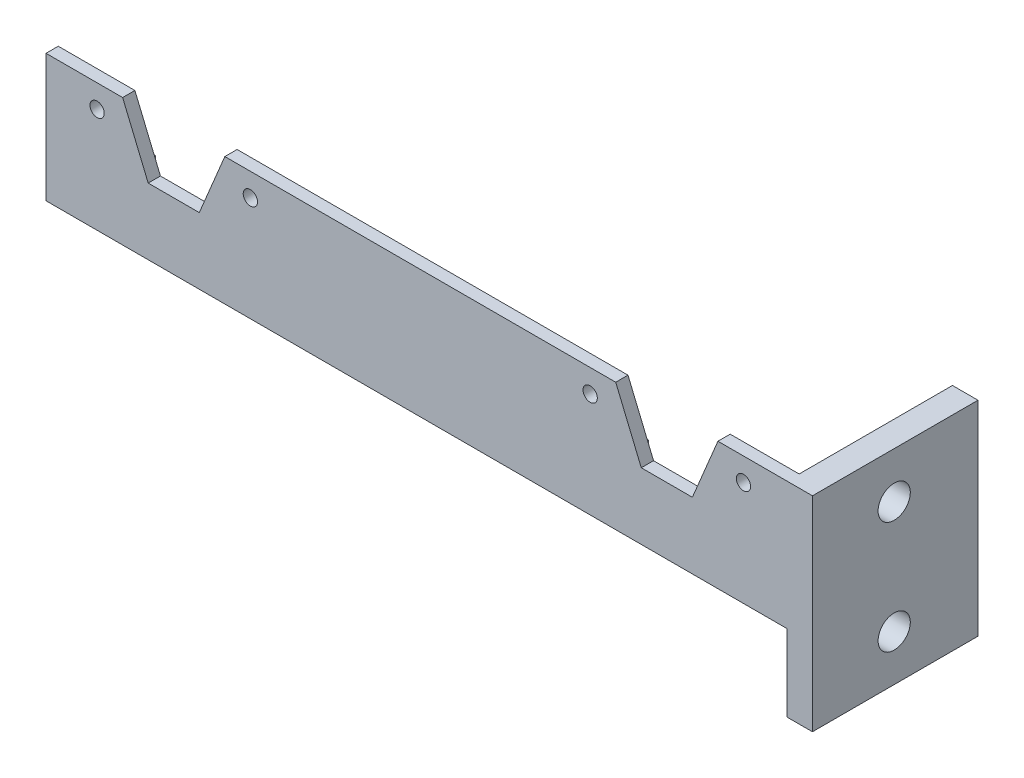
ISO-10303-21;
HEADER;
FILE_DESCRIPTION(('STEP AP214'),'2;1');
FILE_NAME('part.step','',(''),(''),'','','');
FILE_SCHEMA(('AUTOMOTIVE_DESIGN { 1 0 10303 214 1 1 1 1 }'));
ENDSEC;
DATA;
#1=APPLICATION_CONTEXT('core data for automotive mechanical design processes');
#2=APPLICATION_PROTOCOL_DEFINITION('international standard','automotive_design',2000,#1);
#3=PRODUCT_CONTEXT('',#1,'mechanical');
#4=PRODUCT('Part','Part','',(#3));
#5=PRODUCT_RELATED_PRODUCT_CATEGORY('part','',(#4));
#6=PRODUCT_DEFINITION_FORMATION('','',#4);
#7=PRODUCT_DEFINITION_CONTEXT('part definition',#1,'design');
#8=PRODUCT_DEFINITION('design','',#6,#7);
#9=PRODUCT_DEFINITION_SHAPE('','',#8);
#10=(LENGTH_UNIT() NAMED_UNIT(*) SI_UNIT(.MILLI.,.METRE.));
#11=(NAMED_UNIT(*) PLANE_ANGLE_UNIT() SI_UNIT($,.RADIAN.));
#12=(NAMED_UNIT(*) SI_UNIT($,.STERADIAN.) SOLID_ANGLE_UNIT());
#13=UNCERTAINTY_MEASURE_WITH_UNIT(LENGTH_MEASURE(1.E-05),#10,'distance_accuracy_value','');
#14=(GEOMETRIC_REPRESENTATION_CONTEXT(3) GLOBAL_UNCERTAINTY_ASSIGNED_CONTEXT((#13)) GLOBAL_UNIT_ASSIGNED_CONTEXT((#10,
#11,#12)) REPRESENTATION_CONTEXT('',''));
#15=CARTESIAN_POINT('',(0.,0.,0.));
#16=DIRECTION('',(0.,0.,1.));
#17=DIRECTION('',(1.,0.,0.));
#18=AXIS2_PLACEMENT_3D('',#15,#16,#17);
#19=CARTESIAN_POINT('',(-10.1980390271856,4.,-10.));
#20=DIRECTION('',(0.,1.,0.));
#21=DIRECTION('',(0.,0.,1.));
#22=AXIS2_PLACEMENT_3D('',#19,#20,#21);
#23=PLANE('',#22);
#24=DIRECTION('',(1.,0.,0.));
#25=VECTOR('',#24,1.);
#26=CARTESIAN_POINT('',(-10.1980390271856,4.,-10.));
#27=LINE('',#26,#25);
#28=CARTESIAN_POINT('',(41.,4.,-10.));
#29=VERTEX_POINT('',#28);
#30=CARTESIAN_POINT('',(105.5,4.,-10.));
#31=VERTEX_POINT('',#30);
#32=EDGE_CURVE('E281',#29,#31,#27,.T.);
#33=ORIENTED_EDGE('',*,*,#32,.T.);
#34=DIRECTION('',(-0.707106781186545,0.,-0.70710678118655));
#35=VECTOR('',#34,1.);
#36=CARTESIAN_POINT('',(105.5,4.,-10.));
#37=LINE('',#36,#35);
#38=CARTESIAN_POINT('',(111.5,4.,-3.99999999999998));
#39=VERTEX_POINT('',#38);
#40=EDGE_CURVE('E461',#31,#39,#37,.F.);
#41=ORIENTED_EDGE('',*,*,#40,.T.);
#42=DIRECTION('',(0.,0.,1.));
#43=VECTOR('',#42,1.);
#44=CARTESIAN_POINT('',(111.5,4.,-10.));
#45=LINE('',#44,#43);
#46=CARTESIAN_POINT('',(111.5,4.,0.));
#47=VERTEX_POINT('',#46);
#48=EDGE_CURVE('E269',#39,#47,#45,.T.);
#49=ORIENTED_EDGE('',*,*,#48,.T.);
#50=DIRECTION('',(1.,0.,0.));
#51=VECTOR('',#50,1.);
#52=CARTESIAN_POINT('',(-10.1980390271856,4.,0.));
#53=LINE('',#52,#51);
#54=CARTESIAN_POINT('',(35.,4.,0.));
#55=VERTEX_POINT('',#54);
#56=EDGE_CURVE('E262',#55,#47,#53,.T.);
#57=ORIENTED_EDGE('',*,*,#56,.F.);
#58=DIRECTION('',(0.,0.,-1.));
#59=VECTOR('',#58,1.);
#60=CARTESIAN_POINT('',(35.,4.,-10.));
#61=LINE('',#60,#59);
#62=CARTESIAN_POINT('',(35.,4.,-4.));
#63=VERTEX_POINT('',#62);
#64=EDGE_CURVE('E243',#55,#63,#61,.T.);
#65=ORIENTED_EDGE('',*,*,#64,.T.);
#66=DIRECTION('',(-0.707106781186546,0.,0.707106781186549));
#67=VECTOR('',#66,1.);
#68=CARTESIAN_POINT('',(41.,4.,-10.));
#69=LINE('',#68,#67);
#70=EDGE_CURVE('E459',#63,#29,#69,.F.);
#71=ORIENTED_EDGE('',*,*,#70,.T.);
#72=EDGE_LOOP('',(#33,#41,#49,#57,#65,#71));
#73=FACE_BOUND('',#72,.T.);
#74=ADVANCED_FACE('F35',(#73),#23,.F.);
#75=CARTESIAN_POINT('',(5.99999999999997,4.,-10.));
#76=VERTEX_POINT('',#75);
#77=CARTESIAN_POINT('',(9.00000000000002,4.,-10.));
#78=VERTEX_POINT('',#77);
#79=EDGE_CURVE('E282',#76,#78,#27,.T.);
#80=ORIENTED_EDGE('',*,*,#79,.T.);
#81=DIRECTION('',(-0.707106781186546,0.,-0.707106781186549));
#82=VECTOR('',#81,1.);
#83=CARTESIAN_POINT('',(9.00000000000003,4.,-10.));
#84=LINE('',#83,#82);
#85=CARTESIAN_POINT('',(15.,4.,-4.00000000000001));
#86=VERTEX_POINT('',#85);
#87=EDGE_CURVE('E477',#78,#86,#84,.F.);
#88=ORIENTED_EDGE('',*,*,#87,.T.);
#89=DIRECTION('',(0.,0.,1.));
#90=VECTOR('',#89,1.);
#91=CARTESIAN_POINT('',(15.,4.,-10.));
#92=LINE('',#91,#90);
#93=CARTESIAN_POINT('',(15.,4.,0.));
#94=VERTEX_POINT('',#93);
#95=EDGE_CURVE('E254',#86,#94,#92,.T.);
#96=ORIENTED_EDGE('',*,*,#95,.T.);
#97=CARTESIAN_POINT('',(0.,4.,0.));
#98=VERTEX_POINT('',#97);
#99=EDGE_CURVE('E271',#98,#94,#53,.T.);
#100=ORIENTED_EDGE('',*,*,#99,.F.);
#101=DIRECTION('',(0.,0.,-1.));
#102=VECTOR('',#101,1.);
#103=CARTESIAN_POINT('',(0.,4.,-10.));
#104=LINE('',#103,#102);
#105=CARTESIAN_POINT('',(0.,4.,-4.));
#106=VERTEX_POINT('',#105);
#107=EDGE_CURVE('E290',#98,#106,#104,.T.);
#108=ORIENTED_EDGE('',*,*,#107,.T.);
#109=DIRECTION('',(-0.707106781186546,0.,0.707106781186549));
#110=VECTOR('',#109,1.);
#111=CARTESIAN_POINT('',(5.99999999999998,4.,-10.));
#112=LINE('',#111,#110);
#113=EDGE_CURVE('E475',#106,#76,#112,.F.);
#114=ORIENTED_EDGE('',*,*,#113,.T.);
#115=EDGE_LOOP('',(#80,#88,#96,#100,#108,#114));
#116=FACE_BOUND('',#115,.T.);
#117=ADVANCED_FACE('F552',(#116),#23,.F.);
#118=CARTESIAN_POINT('',(-10.1980390271856,4.,-10.));
#119=DIRECTION('',(0.,0.,1.));
#120=DIRECTION('',(1.,0.,0.));
#121=AXIS2_PLACEMENT_3D('',#118,#119,#120);
#122=PLANE('',#121);
#123=DIRECTION('',(1.,0.,0.));
#124=VECTOR('',#123,1.);
#125=CARTESIAN_POINT('',(-10.1980390271856,6.,-10.));
#126=LINE('',#125,#124);
#127=CARTESIAN_POINT('',(41.,6.,-10.));
#128=VERTEX_POINT('',#127);
#129=CARTESIAN_POINT('',(105.5,6.,-10.));
#130=VERTEX_POINT('',#129);
#131=EDGE_CURVE('E285',#128,#130,#126,.T.);
#132=ORIENTED_EDGE('',*,*,#131,.T.);
#133=DIRECTION('',(0.,-1.,0.));
#134=VECTOR('',#133,1.);
#135=CARTESIAN_POINT('',(105.5,4.,-10.));
#136=LINE('',#135,#134);
#137=EDGE_CURVE('E456',#130,#31,#136,.T.);
#138=ORIENTED_EDGE('',*,*,#137,.T.);
#139=ORIENTED_EDGE('',*,*,#32,.F.);
#140=DIRECTION('',(0.,1.,0.));
#141=VECTOR('',#140,1.);
#142=CARTESIAN_POINT('',(41.,4.,-10.));
#143=LINE('',#142,#141);
#144=EDGE_CURVE('E453',#29,#128,#143,.T.);
#145=ORIENTED_EDGE('',*,*,#144,.T.);
#146=EDGE_LOOP('',(#132,#138,#139,#145));
#147=FACE_BOUND('',#146,.T.);
#148=ADVANCED_FACE('F534',(#147),#122,.F.);
#149=CARTESIAN_POINT('',(5.99999999999997,6.,-10.));
#150=VERTEX_POINT('',#149);
#151=CARTESIAN_POINT('',(9.00000000000002,6.,-10.));
#152=VERTEX_POINT('',#151);
#153=EDGE_CURVE('E286',#150,#152,#126,.T.);
#154=ORIENTED_EDGE('',*,*,#153,.T.);
#155=DIRECTION('',(0.,-1.,0.));
#156=VECTOR('',#155,1.);
#157=CARTESIAN_POINT('',(9.00000000000003,4.,-10.));
#158=LINE('',#157,#156);
#159=EDGE_CURVE('E472',#152,#78,#158,.T.);
#160=ORIENTED_EDGE('',*,*,#159,.T.);
#161=ORIENTED_EDGE('',*,*,#79,.F.);
#162=DIRECTION('',(0.,1.,0.));
#163=VECTOR('',#162,1.);
#164=CARTESIAN_POINT('',(5.99999999999998,4.,-10.));
#165=LINE('',#164,#163);
#166=EDGE_CURVE('E469',#76,#150,#165,.T.);
#167=ORIENTED_EDGE('',*,*,#166,.T.);
#168=EDGE_LOOP('',(#154,#160,#161,#167));
#169=FACE_BOUND('',#168,.T.);
#170=ADVANCED_FACE('F567',(#169),#122,.F.);
#171=CARTESIAN_POINT('',(-10.1980390271856,6.,-10.));
#172=DIRECTION('',(0.,-1.,0.));
#173=DIRECTION('',(0.,0.,-1.));
#174=AXIS2_PLACEMENT_3D('',#171,#172,#173);
#175=PLANE('',#174);
#176=DIRECTION('',(0.,0.,-1.));
#177=VECTOR('',#176,1.);
#178=CARTESIAN_POINT('',(111.5,6.,-10.));
#179=LINE('',#178,#177);
#180=CARTESIAN_POINT('',(111.5,6.,0.));
#181=VERTEX_POINT('',#180);
#182=CARTESIAN_POINT('',(111.5,6.,-3.99999999999998));
#183=VERTEX_POINT('',#182);
#184=EDGE_CURVE('E450',#181,#183,#179,.T.);
#185=ORIENTED_EDGE('',*,*,#184,.T.);
#186=DIRECTION('',(0.707106781186545,0.,0.70710678118655));
#187=VECTOR('',#186,1.);
#188=CARTESIAN_POINT('',(105.5,6.,-10.));
#189=LINE('',#188,#187);
#190=EDGE_CURVE('E467',#183,#130,#189,.F.);
#191=ORIENTED_EDGE('',*,*,#190,.T.);
#192=ORIENTED_EDGE('',*,*,#131,.F.);
#193=DIRECTION('',(0.707106781186546,0.,-0.707106781186549));
#194=VECTOR('',#193,1.);
#195=CARTESIAN_POINT('',(41.,6.,-10.));
#196=LINE('',#195,#194);
#197=CARTESIAN_POINT('',(35.,6.,-4.));
#198=VERTEX_POINT('',#197);
#199=EDGE_CURVE('E465',#128,#198,#196,.F.);
#200=ORIENTED_EDGE('',*,*,#199,.T.);
#201=DIRECTION('',(0.,0.,1.));
#202=VECTOR('',#201,1.);
#203=CARTESIAN_POINT('',(35.,6.,-10.));
#204=LINE('',#203,#202);
#205=CARTESIAN_POINT('',(35.,6.,0.));
#206=VERTEX_POINT('',#205);
#207=EDGE_CURVE('E443',#198,#206,#204,.T.);
#208=ORIENTED_EDGE('',*,*,#207,.T.);
#209=DIRECTION('',(1.,0.,0.));
#210=VECTOR('',#209,1.);
#211=CARTESIAN_POINT('',(-10.1980390271856,6.,0.));
#212=LINE('',#211,#210);
#213=EDGE_CURVE('E264',#206,#181,#212,.T.);
#214=ORIENTED_EDGE('',*,*,#213,.T.);
#215=EDGE_LOOP('',(#185,#191,#192,#200,#208,#214));
#216=FACE_BOUND('',#215,.T.);
#217=ADVANCED_FACE('F524',(#216),#175,.F.);
#218=DIRECTION('',(0.,0.,-1.));
#219=VECTOR('',#218,1.);
#220=CARTESIAN_POINT('',(15.,6.,-10.));
#221=LINE('',#220,#219);
#222=CARTESIAN_POINT('',(15.,6.,0.));
#223=VERTEX_POINT('',#222);
#224=CARTESIAN_POINT('',(15.,6.,-4.00000000000001));
#225=VERTEX_POINT('',#224);
#226=EDGE_CURVE('E445',#223,#225,#221,.T.);
#227=ORIENTED_EDGE('',*,*,#226,.T.);
#228=DIRECTION('',(0.707106781186546,0.,0.707106781186549));
#229=VECTOR('',#228,1.);
#230=CARTESIAN_POINT('',(9.00000000000003,6.,-10.));
#231=LINE('',#230,#229);
#232=EDGE_CURVE('E483',#225,#152,#231,.F.);
#233=ORIENTED_EDGE('',*,*,#232,.T.);
#234=ORIENTED_EDGE('',*,*,#153,.F.);
#235=DIRECTION('',(0.707106781186546,0.,-0.707106781186549));
#236=VECTOR('',#235,1.);
#237=CARTESIAN_POINT('',(5.99999999999998,6.,-10.));
#238=LINE('',#237,#236);
#239=CARTESIAN_POINT('',(0.,6.,-4.));
#240=VERTEX_POINT('',#239);
#241=EDGE_CURVE('E481',#150,#240,#238,.F.);
#242=ORIENTED_EDGE('',*,*,#241,.T.);
#243=DIRECTION('',(0.,0.,1.));
#244=VECTOR('',#243,1.);
#245=CARTESIAN_POINT('',(0.,6.,-10.));
#246=LINE('',#245,#244);
#247=CARTESIAN_POINT('',(0.,6.,0.));
#248=VERTEX_POINT('',#247);
#249=EDGE_CURVE('E294',#240,#248,#246,.T.);
#250=ORIENTED_EDGE('',*,*,#249,.T.);
#251=EDGE_CURVE('E287',#248,#223,#212,.T.);
#252=ORIENTED_EDGE('',*,*,#251,.T.);
#253=EDGE_LOOP('',(#227,#233,#234,#242,#250,#252));
#254=FACE_BOUND('',#253,.T.);
#255=ADVANCED_FACE('F625',(#254),#175,.F.);
#256=CARTESIAN_POINT('',(0.,0.,0.));
#257=DIRECTION('',(0.,0.,-1.));
#258=DIRECTION('',(-1.,0.,0.));
#259=AXIS2_PLACEMENT_3D('',#256,#257,#258);
#260=PLANE('',#259);
#261=ORIENTED_EDGE('',*,*,#56,.T.);
#262=DIRECTION('',(0.,1.,0.));
#263=VECTOR('',#262,1.);
#264=CARTESIAN_POINT('',(111.5,-15.,0.));
#265=LINE('',#264,#263);
#266=EDGE_CURVE('E255',#47,#181,#265,.T.);
#267=ORIENTED_EDGE('',*,*,#266,.T.);
#268=ORIENTED_EDGE('',*,*,#213,.F.);
#269=DIRECTION('',(0.,1.,0.));
#270=VECTOR('',#269,1.);
#271=CARTESIAN_POINT('',(35.,-15.,0.));
#272=LINE('',#271,#270);
#273=EDGE_CURVE('E247',#55,#206,#272,.T.);
#274=ORIENTED_EDGE('',*,*,#273,.F.);
#275=EDGE_LOOP('',(#261,#267,#268,#274));
#276=FACE_BOUND('',#275,.T.);
#277=CARTESIAN_POINT('',(131.5,6.,0.));
#278=VERTEX_POINT('',#277);
#279=CARTESIAN_POINT('',(145.,6.,0.));
#280=VERTEX_POINT('',#279);
#281=EDGE_CURVE('E291',#278,#280,#212,.T.);
#282=ORIENTED_EDGE('',*,*,#281,.F.);
#283=DIRECTION('',(0.,1.,0.));
#284=VECTOR('',#283,1.);
#285=CARTESIAN_POINT('',(131.5,-15.,0.));
#286=LINE('',#285,#284);
#287=CARTESIAN_POINT('',(131.5,4.,0.));
#288=VERTEX_POINT('',#287);
#289=EDGE_CURVE('E519',#288,#278,#286,.T.);
#290=ORIENTED_EDGE('',*,*,#289,.F.);
#291=CARTESIAN_POINT('',(145.,4.,0.));
#292=VERTEX_POINT('',#291);
#293=EDGE_CURVE('E272',#288,#292,#53,.T.);
#294=ORIENTED_EDGE('',*,*,#293,.T.);
#295=DIRECTION('',(0.,1.,0.));
#296=VECTOR('',#295,1.);
#297=CARTESIAN_POINT('',(145.,0.,0.));
#298=LINE('',#297,#296);
#299=CARTESIAN_POINT('',(145.,0.,0.));
#300=VERTEX_POINT('',#299);
#301=EDGE_CURVE('E440',#300,#292,#298,.T.);
#302=ORIENTED_EDGE('',*,*,#301,.F.);
#303=DIRECTION('',(1.,0.,0.));
#304=VECTOR('',#303,1.);
#305=CARTESIAN_POINT('',(0.,0.,0.));
#306=LINE('',#305,#304);
#307=CARTESIAN_POINT('',(0.,0.,0.));
#308=VERTEX_POINT('',#307);
#309=EDGE_CURVE('E427',#308,#300,#306,.T.);
#310=ORIENTED_EDGE('',*,*,#309,.F.);
#311=DIRECTION('',(0.,-1.,0.));
#312=VECTOR('',#311,1.);
#313=CARTESIAN_POINT('',(0.,0.,0.));
#314=LINE('',#313,#312);
#315=EDGE_CURVE('E404',#98,#308,#314,.T.);
#316=ORIENTED_EDGE('',*,*,#315,.F.);
#317=ORIENTED_EDGE('',*,*,#99,.T.);
#318=DIRECTION('',(0.,1.,0.));
#319=VECTOR('',#318,1.);
#320=CARTESIAN_POINT('',(15.,-15.,0.));
#321=LINE('',#320,#319);
#322=EDGE_CURVE('E265',#94,#223,#321,.T.);
#323=ORIENTED_EDGE('',*,*,#322,.T.);
#324=ORIENTED_EDGE('',*,*,#251,.F.);
#325=CARTESIAN_POINT('',(0.,25.,0.));
#326=VERTEX_POINT('',#325);
#327=EDGE_CURVE('E424',#326,#248,#314,.T.);
#328=ORIENTED_EDGE('',*,*,#327,.F.);
#329=DIRECTION('',(-1.,0.,0.));
#330=VECTOR('',#329,1.);
#331=CARTESIAN_POINT('',(0.,25.,0.));
#332=LINE('',#331,#330);
#333=CARTESIAN_POINT('',(15.,25.,0.));
#334=VERTEX_POINT('',#333);
#335=EDGE_CURVE('E429',#334,#326,#332,.T.);
#336=ORIENTED_EDGE('',*,*,#335,.F.);
#337=DIRECTION('',(0.384615384615385,-0.923076923076923,0.));
#338=VECTOR('',#337,1.);
#339=CARTESIAN_POINT('',(15.,25.,0.));
#340=LINE('',#339,#338);
#341=CARTESIAN_POINT('',(20.,13.,0.));
#342=VERTEX_POINT('',#341);
#343=EDGE_CURVE('E347',#334,#342,#340,.T.);
#344=ORIENTED_EDGE('',*,*,#343,.T.);
#345=DIRECTION('',(1.,0.,0.));
#346=VECTOR('',#345,1.);
#347=CARTESIAN_POINT('',(30.,13.,0.));
#348=LINE('',#347,#346);
#349=CARTESIAN_POINT('',(30.,13.,0.));
#350=VERTEX_POINT('',#349);
#351=EDGE_CURVE('E350',#342,#350,#348,.T.);
#352=ORIENTED_EDGE('',*,*,#351,.T.);
#353=DIRECTION('',(0.384615384615385,0.923076923076923,0.));
#354=VECTOR('',#353,1.);
#355=CARTESIAN_POINT('',(35.,25.,0.));
#356=LINE('',#355,#354);
#357=CARTESIAN_POINT('',(35.,25.,0.));
#358=VERTEX_POINT('',#357);
#359=EDGE_CURVE('E354',#350,#358,#356,.T.);
#360=ORIENTED_EDGE('',*,*,#359,.T.);
#361=CARTESIAN_POINT('',(111.5,25.,0.));
#362=VERTEX_POINT('',#361);
#363=EDGE_CURVE('E431',#362,#358,#332,.T.);
#364=ORIENTED_EDGE('',*,*,#363,.F.);
#365=DIRECTION('',(0.384615384615385,-0.923076923076923,0.));
#366=VECTOR('',#365,1.);
#367=CARTESIAN_POINT('',(111.5,25.,0.));
#368=LINE('',#367,#366);
#369=CARTESIAN_POINT('',(116.5,13.,0.));
#370=VERTEX_POINT('',#369);
#371=EDGE_CURVE('E383',#362,#370,#368,.T.);
#372=ORIENTED_EDGE('',*,*,#371,.T.);
#373=DIRECTION('',(1.,0.,0.));
#374=VECTOR('',#373,1.);
#375=CARTESIAN_POINT('',(126.5,13.,0.));
#376=LINE('',#375,#374);
#377=CARTESIAN_POINT('',(126.5,13.,0.));
#378=VERTEX_POINT('',#377);
#379=EDGE_CURVE('E386',#370,#378,#376,.T.);
#380=ORIENTED_EDGE('',*,*,#379,.T.);
#381=DIRECTION('',(0.384615384615385,0.923076923076923,0.));
#382=VECTOR('',#381,1.);
#383=CARTESIAN_POINT('',(131.5,25.,0.));
#384=LINE('',#383,#382);
#385=CARTESIAN_POINT('',(131.5,25.,0.));
#386=VERTEX_POINT('',#385);
#387=EDGE_CURVE('E390',#378,#386,#384,.T.);
#388=ORIENTED_EDGE('',*,*,#387,.T.);
#389=CARTESIAN_POINT('',(145.,25.,0.));
#390=VERTEX_POINT('',#389);
#391=EDGE_CURVE('E414',#390,#386,#332,.T.);
#392=ORIENTED_EDGE('',*,*,#391,.F.);
#393=EDGE_CURVE('E439',#280,#390,#298,.T.);
#394=ORIENTED_EDGE('',*,*,#393,.F.);
#395=EDGE_LOOP('',(#282,#290,#294,#302,#310,#316,#317,#323,#324,#328,#336,#344,#352,#360,#364,
#372,#380,#388,#392,#394));
#396=FACE_BOUND('',#395,.T.);
#397=CARTESIAN_POINT('',(136.5,20.5,0.));
#398=DIRECTION('',(0.,0.,1.));
#399=DIRECTION('',(1.,0.,0.));
#400=AXIS2_PLACEMENT_3D('',#397,#398,#399);
#401=CIRCLE('',#400,1.4);
#402=CARTESIAN_POINT('',(137.9,20.5,0.));
#403=VERTEX_POINT('',#402);
#404=EDGE_CURVE('E346',#403,#403,#401,.T.);
#405=ORIENTED_EDGE('',*,*,#404,.T.);
#406=EDGE_LOOP('',(#405));
#407=FACE_BOUND('',#406,.T.);
#408=CARTESIAN_POINT('',(10.,20.5,0.));
#409=DIRECTION('',(0.,0.,1.));
#410=DIRECTION('',(-1.,0.,0.));
#411=AXIS2_PLACEMENT_3D('',#408,#409,#410);
#412=CIRCLE('',#411,1.4);
#413=CARTESIAN_POINT('',(8.6,20.5,0.));
#414=VERTEX_POINT('',#413);
#415=EDGE_CURVE('E333',#414,#414,#412,.T.);
#416=ORIENTED_EDGE('',*,*,#415,.T.);
#417=EDGE_LOOP('',(#416));
#418=FACE_BOUND('',#417,.T.);
#419=CARTESIAN_POINT('',(106.5,20.5,0.));
#420=DIRECTION('',(0.,0.,1.));
#421=DIRECTION('',(-1.,0.,0.));
#422=AXIS2_PLACEMENT_3D('',#419,#420,#421);
#423=CIRCLE('',#422,1.39999999999999);
#424=CARTESIAN_POINT('',(105.1,20.5,0.));
#425=VERTEX_POINT('',#424);
#426=EDGE_CURVE('E340',#425,#425,#423,.T.);
#427=ORIENTED_EDGE('',*,*,#426,.T.);
#428=EDGE_LOOP('',(#427));
#429=FACE_BOUND('',#428,.T.);
#430=CARTESIAN_POINT('',(40.,20.5,0.));
#431=DIRECTION('',(0.,0.,1.));
#432=DIRECTION('',(1.,0.,0.));
#433=AXIS2_PLACEMENT_3D('',#430,#431,#432);
#434=CIRCLE('',#433,1.4);
#435=CARTESIAN_POINT('',(41.4,20.5,0.));
#436=VERTEX_POINT('',#435);
#437=EDGE_CURVE('E362',#436,#436,#434,.T.);
#438=ORIENTED_EDGE('',*,*,#437,.T.);
#439=EDGE_LOOP('',(#438));
#440=FACE_BOUND('',#439,.T.);
#441=ADVANCED_FACE('F259',(#276,#396,#407,#418,#429,#440),#260,.T.);
#442=CARTESIAN_POINT('',(145.,25.,42.7112887414928));
#443=DIRECTION('',(-1.,0.,0.));
#444=DIRECTION('',(0.,0.,1.));
#445=AXIS2_PLACEMENT_3D('',#442,#443,#444);
#446=PLANE('',#445);
#447=CARTESIAN_POINT('',(145.,16.,-13.6));
#448=DIRECTION('',(-1.,0.,0.));
#449=DIRECTION('',(0.,0.,1.));
#450=AXIS2_PLACEMENT_3D('',#447,#448,#449);
#451=CIRCLE('',#450,3.15);
#452=CARTESIAN_POINT('',(145.,16.,-10.45));
#453=VERTEX_POINT('',#452);
#454=EDGE_CURVE('E295',#453,#453,#451,.T.);
#455=ORIENTED_EDGE('',*,*,#454,.F.);
#456=EDGE_LOOP('',(#455));
#457=FACE_BOUND('',#456,.T.);
#458=CARTESIAN_POINT('',(145.,-6.,-13.6));
#459=DIRECTION('',(-1.,0.,0.));
#460=DIRECTION('',(0.,0.,1.));
#461=AXIS2_PLACEMENT_3D('',#458,#459,#460);
#462=CIRCLE('',#461,3.15);
#463=CARTESIAN_POINT('',(145.,-6.,-10.45));
#464=VERTEX_POINT('',#463);
#465=EDGE_CURVE('E299',#464,#464,#462,.T.);
#466=ORIENTED_EDGE('',*,*,#465,.F.);
#467=EDGE_LOOP('',(#466));
#468=FACE_BOUND('',#467,.T.);
#469=ORIENTED_EDGE('',*,*,#301,.T.);
#470=DIRECTION('',(0.,0.,1.));
#471=VECTOR('',#470,1.);
#472=CARTESIAN_POINT('',(145.,4.,-10.));
#473=LINE('',#472,#471);
#474=CARTESIAN_POINT('',(145.,4.,-10.));
#475=VERTEX_POINT('',#474);
#476=EDGE_CURVE('E276',#475,#292,#473,.T.);
#477=ORIENTED_EDGE('',*,*,#476,.F.);
#478=DIRECTION('',(0.,-1.,0.));
#479=VECTOR('',#478,1.);
#480=CARTESIAN_POINT('',(145.,4.,-10.));
#481=LINE('',#480,#479);
#482=CARTESIAN_POINT('',(145.,6.,-10.));
#483=VERTEX_POINT('',#482);
#484=EDGE_CURVE('E506',#483,#475,#481,.T.);
#485=ORIENTED_EDGE('',*,*,#484,.F.);
#486=DIRECTION('',(0.,0.,-1.));
#487=VECTOR('',#486,1.);
#488=CARTESIAN_POINT('',(145.,6.,-10.));
#489=LINE('',#488,#487);
#490=EDGE_CURVE('E501',#280,#483,#489,.T.);
#491=ORIENTED_EDGE('',*,*,#490,.F.);
#492=ORIENTED_EDGE('',*,*,#393,.T.);
#493=DIRECTION('',(0.,0.,-1.));
#494=VECTOR('',#493,1.);
#495=CARTESIAN_POINT('',(145.,25.,42.7112887414928));
#496=LINE('',#495,#494);
#497=CARTESIAN_POINT('',(145.,25.,-30.));
#498=VERTEX_POINT('',#497);
#499=EDGE_CURVE('E323',#390,#498,#496,.T.);
#500=ORIENTED_EDGE('',*,*,#499,.T.);
#501=DIRECTION('',(0.,1.,0.));
#502=VECTOR('',#501,1.);
#503=CARTESIAN_POINT('',(145.,25.,-30.));
#504=LINE('',#503,#502);
#505=CARTESIAN_POINT('',(145.,-15.,-30.));
#506=VERTEX_POINT('',#505);
#507=EDGE_CURVE('E313',#506,#498,#504,.T.);
#508=ORIENTED_EDGE('',*,*,#507,.F.);
#509=DIRECTION('',(0.,0.,-1.));
#510=VECTOR('',#509,1.);
#511=CARTESIAN_POINT('',(145.,-15.,42.7112887414928));
#512=LINE('',#511,#510);
#513=CARTESIAN_POINT('',(145.,-15.,2.4));
#514=VERTEX_POINT('',#513);
#515=EDGE_CURVE('E325',#514,#506,#512,.T.);
#516=ORIENTED_EDGE('',*,*,#515,.F.);
#517=DIRECTION('',(0.,-1.,0.));
#518=VECTOR('',#517,1.);
#519=CARTESIAN_POINT('',(145.,25.,2.4));
#520=LINE('',#519,#518);
#521=CARTESIAN_POINT('',(145.,0.,2.4));
#522=VERTEX_POINT('',#521);
#523=EDGE_CURVE('E320',#522,#514,#520,.T.);
#524=ORIENTED_EDGE('',*,*,#523,.F.);
#525=DIRECTION('',(0.,0.,1.));
#526=VECTOR('',#525,1.);
#527=CARTESIAN_POINT('',(145.,0.,2.4));
#528=LINE('',#527,#526);
#529=EDGE_CURVE('E330',#300,#522,#528,.T.);
#530=ORIENTED_EDGE('',*,*,#529,.F.);
#531=EDGE_LOOP('',(#469,#477,#485,#491,#492,#500,#508,#516,#524,#530));
#532=FACE_BOUND('',#531,.T.);
#533=ADVANCED_FACE('F509',(#457,#468,#532),#446,.T.);
#534=CARTESIAN_POINT('',(0.,25.,2.4));
#535=DIRECTION('',(0.,-1.,0.));
#536=DIRECTION('',(0.,0.,-1.));
#537=AXIS2_PLACEMENT_3D('',#534,#535,#536);
#538=PLANE('',#537);
#539=ORIENTED_EDGE('',*,*,#363,.T.);
#540=DIRECTION('',(0.,0.,1.));
#541=VECTOR('',#540,1.);
#542=CARTESIAN_POINT('',(35.,25.,0.));
#543=LINE('',#542,#541);
#544=CARTESIAN_POINT('',(35.,25.,2.4));
#545=VERTEX_POINT('',#544);
#546=EDGE_CURVE('E366',#358,#545,#543,.T.);
#547=ORIENTED_EDGE('',*,*,#546,.T.);
#548=DIRECTION('',(-1.,0.,0.));
#549=VECTOR('',#548,1.);
#550=CARTESIAN_POINT('',(0.,25.,2.4));
#551=LINE('',#550,#549);
#552=CARTESIAN_POINT('',(111.5,25.,2.4));
#553=VERTEX_POINT('',#552);
#554=EDGE_CURVE('E423',#553,#545,#551,.T.);
#555=ORIENTED_EDGE('',*,*,#554,.F.);
#556=DIRECTION('',(0.,0.,1.));
#557=VECTOR('',#556,1.);
#558=CARTESIAN_POINT('',(111.5,25.,0.));
#559=LINE('',#558,#557);
#560=EDGE_CURVE('E393',#362,#553,#559,.T.);
#561=ORIENTED_EDGE('',*,*,#560,.F.);
#562=EDGE_LOOP('',(#539,#547,#555,#561));
#563=FACE_BOUND('',#562,.T.);
#564=ADVANCED_FACE('F622',(#563),#538,.F.);
#565=DIRECTION('',(0.,0.,1.));
#566=VECTOR('',#565,1.);
#567=CARTESIAN_POINT('',(131.5,25.,0.));
#568=LINE('',#567,#566);
#569=CARTESIAN_POINT('',(131.5,25.,2.4));
#570=VERTEX_POINT('',#569);
#571=EDGE_CURVE('E401',#386,#570,#568,.T.);
#572=ORIENTED_EDGE('',*,*,#571,.T.);
#573=CARTESIAN_POINT('',(150.,25.,2.4));
#574=VERTEX_POINT('',#573);
#575=EDGE_CURVE('E420',#574,#570,#551,.T.);
#576=ORIENTED_EDGE('',*,*,#575,.F.);
#577=DIRECTION('',(0.,0.,-1.));
#578=VECTOR('',#577,1.);
#579=CARTESIAN_POINT('',(150.,25.,2.4));
#580=LINE('',#579,#578);
#581=CARTESIAN_POINT('',(150.,25.,-30.));
#582=VERTEX_POINT('',#581);
#583=EDGE_CURVE('E434',#574,#582,#580,.T.);
#584=ORIENTED_EDGE('',*,*,#583,.T.);
#585=DIRECTION('',(1.,0.,0.));
#586=VECTOR('',#585,1.);
#587=CARTESIAN_POINT('',(150.,25.,-30.));
#588=LINE('',#587,#586);
#589=EDGE_CURVE('E316',#498,#582,#588,.T.);
#590=ORIENTED_EDGE('',*,*,#589,.F.);
#591=ORIENTED_EDGE('',*,*,#499,.F.);
#592=ORIENTED_EDGE('',*,*,#391,.T.);
#593=EDGE_LOOP('',(#572,#576,#584,#590,#591,#592));
#594=FACE_BOUND('',#593,.T.);
#595=ADVANCED_FACE('F608',(#594),#538,.F.);
#596=CARTESIAN_POINT('',(0.,0.,2.4));
#597=DIRECTION('',(1.,0.,0.));
#598=DIRECTION('',(0.,0.,-1.));
#599=AXIS2_PLACEMENT_3D('',#596,#597,#598);
#600=PLANE('',#599);
#601=ORIENTED_EDGE('',*,*,#249,.F.);
#602=DIRECTION('',(0.,-1.,0.));
#603=VECTOR('',#602,1.);
#604=CARTESIAN_POINT('',(0.,0.,-4.));
#605=LINE('',#604,#603);
#606=EDGE_CURVE('E485',#240,#106,#605,.T.);
#607=ORIENTED_EDGE('',*,*,#606,.T.);
#608=ORIENTED_EDGE('',*,*,#107,.F.);
#609=ORIENTED_EDGE('',*,*,#315,.T.);
#610=DIRECTION('',(0.,0.,-1.));
#611=VECTOR('',#610,1.);
#612=CARTESIAN_POINT('',(0.,0.,2.4));
#613=LINE('',#612,#611);
#614=CARTESIAN_POINT('',(0.,0.,2.4));
#615=VERTEX_POINT('',#614);
#616=EDGE_CURVE('E436',#615,#308,#613,.T.);
#617=ORIENTED_EDGE('',*,*,#616,.F.);
#618=DIRECTION('',(0.,-1.,0.));
#619=VECTOR('',#618,1.);
#620=CARTESIAN_POINT('',(0.,0.,2.4));
#621=LINE('',#620,#619);
#622=CARTESIAN_POINT('',(0.,25.,2.4));
#623=VERTEX_POINT('',#622);
#624=EDGE_CURVE('E410',#623,#615,#621,.T.);
#625=ORIENTED_EDGE('',*,*,#624,.F.);
#626=DIRECTION('',(0.,0.,-1.));
#627=VECTOR('',#626,1.);
#628=CARTESIAN_POINT('',(0.,25.,2.4));
#629=LINE('',#628,#627);
#630=EDGE_CURVE('E422',#623,#326,#629,.T.);
#631=ORIENTED_EDGE('',*,*,#630,.T.);
#632=ORIENTED_EDGE('',*,*,#327,.T.);
#633=EDGE_LOOP('',(#601,#607,#608,#609,#617,#625,#631,#632));
#634=FACE_BOUND('',#633,.T.);
#635=ADVANCED_FACE('F604',(#634),#600,.F.);
#636=CARTESIAN_POINT('',(0.,0.,2.4));
#637=DIRECTION('',(0.,1.,0.));
#638=DIRECTION('',(0.,0.,1.));
#639=AXIS2_PLACEMENT_3D('',#636,#637,#638);
#640=PLANE('',#639);
#641=ORIENTED_EDGE('',*,*,#309,.T.);
#642=ORIENTED_EDGE('',*,*,#529,.T.);
#643=DIRECTION('',(1.,0.,0.));
#644=VECTOR('',#643,1.);
#645=CARTESIAN_POINT('',(0.,0.,2.4));
#646=LINE('',#645,#644);
#647=EDGE_CURVE('E413',#615,#522,#646,.T.);
#648=ORIENTED_EDGE('',*,*,#647,.F.);
#649=ORIENTED_EDGE('',*,*,#616,.T.);
#650=EDGE_LOOP('',(#641,#642,#648,#649));
#651=FACE_BOUND('',#650,.T.);
#652=ADVANCED_FACE('F607',(#651),#640,.F.);
#653=CARTESIAN_POINT('',(150.,0.,2.4));
#654=DIRECTION('',(-1.,0.,0.));
#655=DIRECTION('',(0.,0.,1.));
#656=AXIS2_PLACEMENT_3D('',#653,#654,#655);
#657=PLANE('',#656);
#658=CARTESIAN_POINT('',(150.,16.,-13.6));
#659=DIRECTION('',(-1.,0.,0.));
#660=DIRECTION('',(0.,0.,1.));
#661=AXIS2_PLACEMENT_3D('',#658,#659,#660);
#662=CIRCLE('',#661,3.15);
#663=CARTESIAN_POINT('',(150.,16.,-10.45));
#664=VERTEX_POINT('',#663);
#665=EDGE_CURVE('E304',#664,#664,#662,.T.);
#666=ORIENTED_EDGE('',*,*,#665,.T.);
#667=EDGE_LOOP('',(#666));
#668=FACE_BOUND('',#667,.T.);
#669=CARTESIAN_POINT('',(150.,-6.,-13.6));
#670=DIRECTION('',(-1.,0.,0.));
#671=DIRECTION('',(0.,0.,1.));
#672=AXIS2_PLACEMENT_3D('',#669,#670,#671);
#673=CIRCLE('',#672,3.15);
#674=CARTESIAN_POINT('',(150.,-6.,-10.45));
#675=VERTEX_POINT('',#674);
#676=EDGE_CURVE('E298',#675,#675,#673,.T.);
#677=ORIENTED_EDGE('',*,*,#676,.T.);
#678=EDGE_LOOP('',(#677));
#679=FACE_BOUND('',#678,.T.);
#680=DIRECTION('',(0.,1.,0.));
#681=VECTOR('',#680,1.);
#682=CARTESIAN_POINT('',(150.,0.,2.4));
#683=LINE('',#682,#681);
#684=CARTESIAN_POINT('',(150.,-15.,2.4));
#685=VERTEX_POINT('',#684);
#686=EDGE_CURVE('E417',#685,#574,#683,.T.);
#687=ORIENTED_EDGE('',*,*,#686,.F.);
#688=DIRECTION('',(0.,0.,-1.));
#689=VECTOR('',#688,1.);
#690=CARTESIAN_POINT('',(150.,-15.,42.7112887414928));
#691=LINE('',#690,#689);
#692=CARTESIAN_POINT('',(150.,-15.,-30.));
#693=VERTEX_POINT('',#692);
#694=EDGE_CURVE('E319',#685,#693,#691,.T.);
#695=ORIENTED_EDGE('',*,*,#694,.T.);
#696=DIRECTION('',(0.,-1.,0.));
#697=VECTOR('',#696,1.);
#698=CARTESIAN_POINT('',(150.,25.,-30.));
#699=LINE('',#698,#697);
#700=EDGE_CURVE('E307',#582,#693,#699,.T.);
#701=ORIENTED_EDGE('',*,*,#700,.F.);
#702=ORIENTED_EDGE('',*,*,#583,.F.);
#703=EDGE_LOOP('',(#687,#695,#701,#702));
#704=FACE_BOUND('',#703,.T.);
#705=ADVANCED_FACE('F612',(#668,#679,#704),#657,.F.);
#706=CARTESIAN_POINT('',(15.,25.,2.4));
#707=VERTEX_POINT('',#706);
#708=EDGE_CURVE('E419',#707,#623,#551,.T.);
#709=ORIENTED_EDGE('',*,*,#708,.F.);
#710=DIRECTION('',(0.,0.,1.));
#711=VECTOR('',#710,1.);
#712=CARTESIAN_POINT('',(15.,25.,0.));
#713=LINE('',#712,#711);
#714=EDGE_CURVE('E357',#334,#707,#713,.T.);
#715=ORIENTED_EDGE('',*,*,#714,.F.);
#716=ORIENTED_EDGE('',*,*,#335,.T.);
#717=ORIENTED_EDGE('',*,*,#630,.F.);
#718=EDGE_LOOP('',(#709,#715,#716,#717));
#719=FACE_BOUND('',#718,.T.);
#720=ADVANCED_FACE('F616',(#719),#538,.F.);
#721=CARTESIAN_POINT('',(0.,0.,2.4));
#722=DIRECTION('',(0.,0.,-1.));
#723=DIRECTION('',(-1.,0.,0.));
#724=AXIS2_PLACEMENT_3D('',#721,#722,#723);
#725=PLANE('',#724);
#726=CARTESIAN_POINT('',(136.5,20.5,2.4));
#727=DIRECTION('',(0.,0.,1.));
#728=DIRECTION('',(1.,0.,0.));
#729=AXIS2_PLACEMENT_3D('',#726,#727,#728);
#730=CIRCLE('',#729,1.4);
#731=CARTESIAN_POINT('',(137.9,20.5,2.4));
#732=VERTEX_POINT('',#731);
#733=EDGE_CURVE('E332',#732,#732,#730,.T.);
#734=ORIENTED_EDGE('',*,*,#733,.F.);
#735=EDGE_LOOP('',(#734));
#736=FACE_BOUND('',#735,.T.);
#737=CARTESIAN_POINT('',(40.,20.5,2.4));
#738=DIRECTION('',(0.,0.,1.));
#739=DIRECTION('',(1.,0.,0.));
#740=AXIS2_PLACEMENT_3D('',#737,#738,#739);
#741=CIRCLE('',#740,1.4);
#742=CARTESIAN_POINT('',(41.4,20.5,2.4));
#743=VERTEX_POINT('',#742);
#744=EDGE_CURVE('E336',#743,#743,#741,.T.);
#745=ORIENTED_EDGE('',*,*,#744,.F.);
#746=EDGE_LOOP('',(#745));
#747=FACE_BOUND('',#746,.T.);
#748=CARTESIAN_POINT('',(10.,20.5,2.4));
#749=DIRECTION('',(0.,0.,1.));
#750=DIRECTION('',(-1.,0.,0.));
#751=AXIS2_PLACEMENT_3D('',#748,#749,#750);
#752=CIRCLE('',#751,1.4);
#753=CARTESIAN_POINT('',(8.6,20.5,2.4));
#754=VERTEX_POINT('',#753);
#755=EDGE_CURVE('E337',#754,#754,#752,.T.);
#756=ORIENTED_EDGE('',*,*,#755,.F.);
#757=EDGE_LOOP('',(#756));
#758=FACE_BOUND('',#757,.T.);
#759=CARTESIAN_POINT('',(106.5,20.5,2.4));
#760=DIRECTION('',(0.,0.,1.));
#761=DIRECTION('',(-1.,0.,0.));
#762=AXIS2_PLACEMENT_3D('',#759,#760,#761);
#763=CIRCLE('',#762,1.39999999999999);
#764=CARTESIAN_POINT('',(105.1,20.5,2.4));
#765=VERTEX_POINT('',#764);
#766=EDGE_CURVE('E343',#765,#765,#763,.T.);
#767=ORIENTED_EDGE('',*,*,#766,.F.);
#768=EDGE_LOOP('',(#767));
#769=FACE_BOUND('',#768,.T.);
#770=ORIENTED_EDGE('',*,*,#647,.T.);
#771=ORIENTED_EDGE('',*,*,#523,.T.);
#772=DIRECTION('',(1.,0.,0.));
#773=VECTOR('',#772,1.);
#774=CARTESIAN_POINT('',(150.,-15.,2.4));
#775=LINE('',#774,#773);
#776=EDGE_CURVE('E322',#514,#685,#775,.T.);
#777=ORIENTED_EDGE('',*,*,#776,.T.);
#778=ORIENTED_EDGE('',*,*,#686,.T.);
#779=ORIENTED_EDGE('',*,*,#575,.T.);
#780=DIRECTION('',(0.384615384615385,0.923076923076923,0.));
#781=VECTOR('',#780,1.);
#782=CARTESIAN_POINT('',(131.5,25.,2.4));
#783=LINE('',#782,#781);
#784=CARTESIAN_POINT('',(126.5,13.,2.4));
#785=VERTEX_POINT('',#784);
#786=EDGE_CURVE('E387',#785,#570,#783,.T.);
#787=ORIENTED_EDGE('',*,*,#786,.F.);
#788=DIRECTION('',(1.,0.,0.));
#789=VECTOR('',#788,1.);
#790=CARTESIAN_POINT('',(126.5,13.,2.4));
#791=LINE('',#790,#789);
#792=CARTESIAN_POINT('',(116.5,13.,2.4));
#793=VERTEX_POINT('',#792);
#794=EDGE_CURVE('E396',#793,#785,#791,.T.);
#795=ORIENTED_EDGE('',*,*,#794,.F.);
#796=DIRECTION('',(0.384615384615385,-0.923076923076923,0.));
#797=VECTOR('',#796,1.);
#798=CARTESIAN_POINT('',(111.5,25.,2.4));
#799=LINE('',#798,#797);
#800=EDGE_CURVE('E369',#553,#793,#799,.T.);
#801=ORIENTED_EDGE('',*,*,#800,.F.);
#802=ORIENTED_EDGE('',*,*,#554,.T.);
#803=DIRECTION('',(0.384615384615385,0.923076923076923,0.));
#804=VECTOR('',#803,1.);
#805=CARTESIAN_POINT('',(35.,25.,2.4));
#806=LINE('',#805,#804);
#807=CARTESIAN_POINT('',(30.,13.,2.4));
#808=VERTEX_POINT('',#807);
#809=EDGE_CURVE('E351',#808,#545,#806,.T.);
#810=ORIENTED_EDGE('',*,*,#809,.F.);
#811=DIRECTION('',(1.,0.,0.));
#812=VECTOR('',#811,1.);
#813=CARTESIAN_POINT('',(30.,13.,2.4));
#814=LINE('',#813,#812);
#815=CARTESIAN_POINT('',(20.,13.,2.4));
#816=VERTEX_POINT('',#815);
#817=EDGE_CURVE('E361',#816,#808,#814,.T.);
#818=ORIENTED_EDGE('',*,*,#817,.F.);
#819=DIRECTION('',(0.384615384615385,-0.923076923076923,0.));
#820=VECTOR('',#819,1.);
#821=CARTESIAN_POINT('',(15.,25.,2.4));
#822=LINE('',#821,#820);
#823=EDGE_CURVE('E358',#707,#816,#822,.T.);
#824=ORIENTED_EDGE('',*,*,#823,.F.);
#825=ORIENTED_EDGE('',*,*,#708,.T.);
#826=ORIENTED_EDGE('',*,*,#624,.T.);
#827=EDGE_LOOP('',(#770,#771,#777,#778,#779,#787,#795,#801,#802,#810,#818,#824,#825,#826));
#828=FACE_BOUND('',#827,.T.);
#829=ADVANCED_FACE('F620',(#736,#747,#758,#769,#828),#725,.F.);
#830=CARTESIAN_POINT('',(131.5,25.,0.));
#831=DIRECTION('',(0.923076923076923,-0.384615384615385,0.));
#832=DIRECTION('',(0.384615384615385,0.923076923076923,0.));
#833=AXIS2_PLACEMENT_3D('',#830,#831,#832);
#834=PLANE('',#833);
#835=ORIENTED_EDGE('',*,*,#786,.T.);
#836=ORIENTED_EDGE('',*,*,#571,.F.);
#837=ORIENTED_EDGE('',*,*,#387,.F.);
#838=DIRECTION('',(0.,0.,1.));
#839=VECTOR('',#838,1.);
#840=CARTESIAN_POINT('',(126.5,13.,0.));
#841=LINE('',#840,#839);
#842=EDGE_CURVE('E405',#378,#785,#841,.T.);
#843=ORIENTED_EDGE('',*,*,#842,.T.);
#844=EDGE_LOOP('',(#835,#836,#837,#843));
#845=FACE_BOUND('',#844,.T.);
#846=ADVANCED_FACE('F628',(#845),#834,.F.);
#847=CARTESIAN_POINT('',(126.5,13.,0.));
#848=DIRECTION('',(0.,-1.,0.));
#849=DIRECTION('',(1.,0.,0.));
#850=AXIS2_PLACEMENT_3D('',#847,#848,#849);
#851=PLANE('',#850);
#852=ORIENTED_EDGE('',*,*,#794,.T.);
#853=ORIENTED_EDGE('',*,*,#842,.F.);
#854=ORIENTED_EDGE('',*,*,#379,.F.);
#855=DIRECTION('',(0.,0.,1.));
#856=VECTOR('',#855,1.);
#857=CARTESIAN_POINT('',(116.5,13.,0.));
#858=LINE('',#857,#856);
#859=EDGE_CURVE('E407',#370,#793,#858,.T.);
#860=ORIENTED_EDGE('',*,*,#859,.T.);
#861=EDGE_LOOP('',(#852,#853,#854,#860));
#862=FACE_BOUND('',#861,.T.);
#863=ADVANCED_FACE('F634',(#862),#851,.F.);
#864=CARTESIAN_POINT('',(111.5,25.,0.));
#865=DIRECTION('',(-0.923076923076923,-0.384615384615385,0.));
#866=DIRECTION('',(0.384615384615385,-0.923076923076923,0.));
#867=AXIS2_PLACEMENT_3D('',#864,#865,#866);
#868=PLANE('',#867);
#869=ORIENTED_EDGE('',*,*,#800,.T.);
#870=ORIENTED_EDGE('',*,*,#859,.F.);
#871=ORIENTED_EDGE('',*,*,#371,.F.);
#872=ORIENTED_EDGE('',*,*,#560,.T.);
#873=EDGE_LOOP('',(#869,#870,#871,#872));
#874=FACE_BOUND('',#873,.T.);
#875=ADVANCED_FACE('F630',(#874),#868,.F.);
#876=CARTESIAN_POINT('',(106.5,20.5,0.));
#877=DIRECTION('',(0.,0.,1.));
#878=DIRECTION('',(1.,0.,0.));
#879=AXIS2_PLACEMENT_3D('',#876,#877,#878);
#880=CYLINDRICAL_SURFACE('',#879,1.39999999999999);
#881=ORIENTED_EDGE('',*,*,#426,.F.);
#882=EDGE_LOOP('',(#881));
#883=FACE_BOUND('',#882,.T.);
#884=ORIENTED_EDGE('',*,*,#766,.T.);
#885=EDGE_LOOP('',(#884));
#886=FACE_BOUND('',#885,.T.);
#887=ADVANCED_FACE('F633',(#883,#886),#880,.F.);
#888=CARTESIAN_POINT('',(10.,20.5,0.));
#889=DIRECTION('',(0.,0.,1.));
#890=DIRECTION('',(1.,0.,0.));
#891=AXIS2_PLACEMENT_3D('',#888,#889,#890);
#892=CYLINDRICAL_SURFACE('',#891,1.4);
#893=ORIENTED_EDGE('',*,*,#415,.F.);
#894=EDGE_LOOP('',(#893));
#895=FACE_BOUND('',#894,.T.);
#896=ORIENTED_EDGE('',*,*,#755,.T.);
#897=EDGE_LOOP('',(#896));
#898=FACE_BOUND('',#897,.T.);
#899=ADVANCED_FACE('F652',(#895,#898),#892,.F.);
#900=CARTESIAN_POINT('',(40.,20.5,0.));
#901=DIRECTION('',(0.,0.,1.));
#902=DIRECTION('',(1.,0.,0.));
#903=AXIS2_PLACEMENT_3D('',#900,#901,#902);
#904=CYLINDRICAL_SURFACE('',#903,1.4);
#905=ORIENTED_EDGE('',*,*,#437,.F.);
#906=EDGE_LOOP('',(#905));
#907=FACE_BOUND('',#906,.T.);
#908=ORIENTED_EDGE('',*,*,#744,.T.);
#909=EDGE_LOOP('',(#908));
#910=FACE_BOUND('',#909,.T.);
#911=ADVANCED_FACE('F648',(#907,#910),#904,.F.);
#912=CARTESIAN_POINT('',(35.,25.,0.));
#913=DIRECTION('',(0.923076923076923,-0.384615384615385,0.));
#914=DIRECTION('',(0.384615384615385,0.923076923076923,0.));
#915=AXIS2_PLACEMENT_3D('',#912,#913,#914);
#916=PLANE('',#915);
#917=ORIENTED_EDGE('',*,*,#809,.T.);
#918=ORIENTED_EDGE('',*,*,#546,.F.);
#919=ORIENTED_EDGE('',*,*,#359,.F.);
#920=DIRECTION('',(0.,0.,1.));
#921=VECTOR('',#920,1.);
#922=CARTESIAN_POINT('',(30.,13.,0.));
#923=LINE('',#922,#921);
#924=EDGE_CURVE('E370',#350,#808,#923,.T.);
#925=ORIENTED_EDGE('',*,*,#924,.T.);
#926=EDGE_LOOP('',(#917,#918,#919,#925));
#927=FACE_BOUND('',#926,.T.);
#928=ADVANCED_FACE('F651',(#927),#916,.F.);
#929=CARTESIAN_POINT('',(30.,13.,0.));
#930=DIRECTION('',(0.,-1.,0.));
#931=DIRECTION('',(1.,0.,0.));
#932=AXIS2_PLACEMENT_3D('',#929,#930,#931);
#933=PLANE('',#932);
#934=ORIENTED_EDGE('',*,*,#817,.T.);
#935=ORIENTED_EDGE('',*,*,#924,.F.);
#936=ORIENTED_EDGE('',*,*,#351,.F.);
#937=DIRECTION('',(0.,0.,1.));
#938=VECTOR('',#937,1.);
#939=CARTESIAN_POINT('',(20.,13.,0.));
#940=LINE('',#939,#938);
#941=EDGE_CURVE('E372',#342,#816,#940,.T.);
#942=ORIENTED_EDGE('',*,*,#941,.T.);
#943=EDGE_LOOP('',(#934,#935,#936,#942));
#944=FACE_BOUND('',#943,.T.);
#945=ADVANCED_FACE('F656',(#944),#933,.F.);
#946=CARTESIAN_POINT('',(15.,25.,0.));
#947=DIRECTION('',(-0.923076923076923,-0.384615384615385,0.));
#948=DIRECTION('',(0.384615384615385,-0.923076923076923,0.));
#949=AXIS2_PLACEMENT_3D('',#946,#947,#948);
#950=PLANE('',#949);
#951=ORIENTED_EDGE('',*,*,#823,.T.);
#952=ORIENTED_EDGE('',*,*,#941,.F.);
#953=ORIENTED_EDGE('',*,*,#343,.F.);
#954=ORIENTED_EDGE('',*,*,#714,.T.);
#955=EDGE_LOOP('',(#951,#952,#953,#954));
#956=FACE_BOUND('',#955,.T.);
#957=ADVANCED_FACE('F646',(#956),#950,.F.);
#958=CARTESIAN_POINT('',(136.5,20.5,0.));
#959=DIRECTION('',(0.,0.,1.));
#960=DIRECTION('',(1.,0.,0.));
#961=AXIS2_PLACEMENT_3D('',#958,#959,#960);
#962=CYLINDRICAL_SURFACE('',#961,1.4);
#963=ORIENTED_EDGE('',*,*,#404,.F.);
#964=EDGE_LOOP('',(#963));
#965=FACE_BOUND('',#964,.T.);
#966=ORIENTED_EDGE('',*,*,#733,.T.);
#967=EDGE_LOOP('',(#966));
#968=FACE_BOUND('',#967,.T.);
#969=ADVANCED_FACE('F642',(#965,#968),#962,.F.);
#970=CARTESIAN_POINT('',(150.,-15.,42.7112887414928));
#971=DIRECTION('',(0.,-1.,0.));
#972=DIRECTION('',(0.,0.,-1.));
#973=AXIS2_PLACEMENT_3D('',#970,#971,#972);
#974=PLANE('',#973);
#975=ORIENTED_EDGE('',*,*,#776,.F.);
#976=ORIENTED_EDGE('',*,*,#515,.T.);
#977=DIRECTION('',(-1.,0.,0.));
#978=VECTOR('',#977,1.);
#979=CARTESIAN_POINT('',(150.,-15.,-30.));
#980=LINE('',#979,#978);
#981=EDGE_CURVE('E310',#693,#506,#980,.T.);
#982=ORIENTED_EDGE('',*,*,#981,.F.);
#983=ORIENTED_EDGE('',*,*,#694,.F.);
#984=EDGE_LOOP('',(#975,#976,#982,#983));
#985=FACE_BOUND('',#984,.T.);
#986=ADVANCED_FACE('F645',(#985),#974,.T.);
#987=CARTESIAN_POINT('',(0.,0.,-30.));
#988=DIRECTION('',(0.,0.,-1.));
#989=DIRECTION('',(-1.,0.,0.));
#990=AXIS2_PLACEMENT_3D('',#987,#988,#989);
#991=PLANE('',#990);
#992=ORIENTED_EDGE('',*,*,#700,.T.);
#993=ORIENTED_EDGE('',*,*,#981,.T.);
#994=ORIENTED_EDGE('',*,*,#507,.T.);
#995=ORIENTED_EDGE('',*,*,#589,.T.);
#996=EDGE_LOOP('',(#992,#993,#994,#995));
#997=FACE_BOUND('',#996,.T.);
#998=ADVANCED_FACE('F672',(#997),#991,.T.);
#999=CARTESIAN_POINT('',(175.,-6.,-13.6));
#1000=DIRECTION('',(-1.,0.,0.));
#1001=DIRECTION('',(0.,0.,1.));
#1002=AXIS2_PLACEMENT_3D('',#999,#1000,#1001);
#1003=CYLINDRICAL_SURFACE('',#1002,3.15);
#1004=ORIENTED_EDGE('',*,*,#465,.T.);
#1005=EDGE_LOOP('',(#1004));
#1006=FACE_BOUND('',#1005,.T.);
#1007=ORIENTED_EDGE('',*,*,#676,.F.);
#1008=EDGE_LOOP('',(#1007));
#1009=FACE_BOUND('',#1008,.T.);
#1010=ADVANCED_FACE('F568',(#1006,#1009),#1003,.F.);
#1011=CARTESIAN_POINT('',(175.,16.,-13.6));
#1012=DIRECTION('',(-1.,0.,0.));
#1013=DIRECTION('',(0.,0.,1.));
#1014=AXIS2_PLACEMENT_3D('',#1011,#1012,#1013);
#1015=CYLINDRICAL_SURFACE('',#1014,3.15);
#1016=ORIENTED_EDGE('',*,*,#454,.T.);
#1017=EDGE_LOOP('',(#1016));
#1018=FACE_BOUND('',#1017,.T.);
#1019=ORIENTED_EDGE('',*,*,#665,.F.);
#1020=EDGE_LOOP('',(#1019));
#1021=FACE_BOUND('',#1020,.T.);
#1022=ADVANCED_FACE('F561',(#1018,#1021),#1015,.F.);
#1023=DIRECTION('',(0.,0.,-1.));
#1024=VECTOR('',#1023,1.);
#1025=CARTESIAN_POINT('',(131.5,4.,-10.));
#1026=LINE('',#1025,#1024);
#1027=CARTESIAN_POINT('',(131.5,4.,-3.99999999999997));
#1028=VERTEX_POINT('',#1027);
#1029=EDGE_CURVE('E514',#288,#1028,#1026,.T.);
#1030=ORIENTED_EDGE('',*,*,#1029,.T.);
#1031=DIRECTION('',(-0.707106781186546,0.,0.707106781186549));
#1032=VECTOR('',#1031,1.);
#1033=CARTESIAN_POINT('',(137.5,4.,-10.));
#1034=LINE('',#1033,#1032);
#1035=CARTESIAN_POINT('',(137.5,4.,-10.));
#1036=VERTEX_POINT('',#1035);
#1037=EDGE_CURVE('E11',#1028,#1036,#1034,.F.);
#1038=ORIENTED_EDGE('',*,*,#1037,.T.);
#1039=EDGE_CURVE('E275',#1036,#475,#27,.T.);
#1040=ORIENTED_EDGE('',*,*,#1039,.T.);
#1041=ORIENTED_EDGE('',*,*,#476,.T.);
#1042=ORIENTED_EDGE('',*,*,#293,.F.);
#1043=EDGE_LOOP('',(#1030,#1038,#1040,#1041,#1042));
#1044=FACE_BOUND('',#1043,.T.);
#1045=ADVANCED_FACE('F554',(#1044),#23,.F.);
#1046=ORIENTED_EDGE('',*,*,#1039,.F.);
#1047=DIRECTION('',(0.,1.,0.));
#1048=VECTOR('',#1047,1.);
#1049=CARTESIAN_POINT('',(137.5,4.,-10.));
#1050=LINE('',#1049,#1048);
#1051=CARTESIAN_POINT('',(137.5,6.,-10.));
#1052=VERTEX_POINT('',#1051);
#1053=EDGE_CURVE('E488',#1036,#1052,#1050,.T.);
#1054=ORIENTED_EDGE('',*,*,#1053,.T.);
#1055=EDGE_CURVE('E283',#1052,#483,#126,.T.);
#1056=ORIENTED_EDGE('',*,*,#1055,.T.);
#1057=ORIENTED_EDGE('',*,*,#484,.T.);
#1058=EDGE_LOOP('',(#1046,#1054,#1056,#1057));
#1059=FACE_BOUND('',#1058,.T.);
#1060=ADVANCED_FACE('F494',(#1059),#122,.F.);
#1061=ORIENTED_EDGE('',*,*,#1055,.F.);
#1062=DIRECTION('',(0.707106781186546,0.,-0.707106781186549));
#1063=VECTOR('',#1062,1.);
#1064=CARTESIAN_POINT('',(137.5,6.,-10.));
#1065=LINE('',#1064,#1063);
#1066=CARTESIAN_POINT('',(131.5,6.,-3.99999999999997));
#1067=VERTEX_POINT('',#1066);
#1068=EDGE_CURVE('E58',#1052,#1067,#1065,.F.);
#1069=ORIENTED_EDGE('',*,*,#1068,.T.);
#1070=DIRECTION('',(0.,0.,1.));
#1071=VECTOR('',#1070,1.);
#1072=CARTESIAN_POINT('',(131.5,6.,-10.));
#1073=LINE('',#1072,#1071);
#1074=EDGE_CURVE('E448',#1067,#278,#1073,.T.);
#1075=ORIENTED_EDGE('',*,*,#1074,.T.);
#1076=ORIENTED_EDGE('',*,*,#281,.T.);
#1077=ORIENTED_EDGE('',*,*,#490,.T.);
#1078=EDGE_LOOP('',(#1061,#1069,#1075,#1076,#1077));
#1079=FACE_BOUND('',#1078,.T.);
#1080=ADVANCED_FACE('F499',(#1079),#175,.F.);
#1081=CARTESIAN_POINT('',(15.,-15.,-13.0068606142067));
#1082=DIRECTION('',(-1.,0.,0.));
#1083=DIRECTION('',(0.,0.,1.));
#1084=AXIS2_PLACEMENT_3D('',#1081,#1082,#1083);
#1085=PLANE('',#1084);
#1086=ORIENTED_EDGE('',*,*,#95,.F.);
#1087=DIRECTION('',(0.,1.,0.));
#1088=VECTOR('',#1087,1.);
#1089=CARTESIAN_POINT('',(15.,-15.,-4.00000000000001));
#1090=LINE('',#1089,#1088);
#1091=EDGE_CURVE('E479',#86,#225,#1090,.T.);
#1092=ORIENTED_EDGE('',*,*,#1091,.T.);
#1093=ORIENTED_EDGE('',*,*,#226,.F.);
#1094=ORIENTED_EDGE('',*,*,#322,.F.);
#1095=EDGE_LOOP('',(#1086,#1092,#1093,#1094));
#1096=FACE_BOUND('',#1095,.T.);
#1097=ADVANCED_FACE('F549',(#1096),#1085,.F.);
#1098=CARTESIAN_POINT('',(35.,-15.,0.));
#1099=DIRECTION('',(1.,0.,0.));
#1100=DIRECTION('',(0.,0.,-1.));
#1101=AXIS2_PLACEMENT_3D('',#1098,#1099,#1100);
#1102=PLANE('',#1101);
#1103=ORIENTED_EDGE('',*,*,#207,.F.);
#1104=DIRECTION('',(0.,-1.,0.));
#1105=VECTOR('',#1104,1.);
#1106=CARTESIAN_POINT('',(35.,-15.,-4.));
#1107=LINE('',#1106,#1105);
#1108=EDGE_CURVE('E250',#198,#63,#1107,.T.);
#1109=ORIENTED_EDGE('',*,*,#1108,.T.);
#1110=ORIENTED_EDGE('',*,*,#64,.F.);
#1111=ORIENTED_EDGE('',*,*,#273,.T.);
#1112=EDGE_LOOP('',(#1103,#1109,#1110,#1111));
#1113=FACE_BOUND('',#1112,.T.);
#1114=ADVANCED_FACE('F246',(#1113),#1102,.F.);
#1115=CARTESIAN_POINT('',(111.5,-15.,-12.5408748477051));
#1116=DIRECTION('',(-1.,0.,0.));
#1117=DIRECTION('',(0.,0.,1.));
#1118=AXIS2_PLACEMENT_3D('',#1115,#1116,#1117);
#1119=PLANE('',#1118);
#1120=ORIENTED_EDGE('',*,*,#48,.F.);
#1121=DIRECTION('',(0.,1.,0.));
#1122=VECTOR('',#1121,1.);
#1123=CARTESIAN_POINT('',(111.5,-15.,-3.99999999999998));
#1124=LINE('',#1123,#1122);
#1125=EDGE_CURVE('E463',#39,#183,#1124,.T.);
#1126=ORIENTED_EDGE('',*,*,#1125,.T.);
#1127=ORIENTED_EDGE('',*,*,#184,.F.);
#1128=ORIENTED_EDGE('',*,*,#266,.F.);
#1129=EDGE_LOOP('',(#1120,#1126,#1127,#1128));
#1130=FACE_BOUND('',#1129,.T.);
#1131=ADVANCED_FACE('F540',(#1130),#1119,.F.);
#1132=CARTESIAN_POINT('',(131.5,-15.,0.));
#1133=DIRECTION('',(1.,0.,0.));
#1134=DIRECTION('',(0.,0.,-1.));
#1135=AXIS2_PLACEMENT_3D('',#1132,#1133,#1134);
#1136=PLANE('',#1135);
#1137=ORIENTED_EDGE('',*,*,#1074,.F.);
#1138=DIRECTION('',(0.,-1.,0.));
#1139=VECTOR('',#1138,1.);
#1140=CARTESIAN_POINT('',(131.5,-15.,-3.99999999999997));
#1141=LINE('',#1140,#1139);
#1142=EDGE_CURVE('E44',#1067,#1028,#1141,.T.);
#1143=ORIENTED_EDGE('',*,*,#1142,.T.);
#1144=ORIENTED_EDGE('',*,*,#1029,.F.);
#1145=ORIENTED_EDGE('',*,*,#289,.T.);
#1146=EDGE_LOOP('',(#1137,#1143,#1144,#1145));
#1147=FACE_BOUND('',#1146,.T.);
#1148=ADVANCED_FACE('F542',(#1147),#1136,.F.);
#1149=CARTESIAN_POINT('',(105.5,4.,-10.));
#1150=DIRECTION('',(-0.70710678118655,0.,0.707106781186545));
#1151=DIRECTION('',(0.,-1.,0.));
#1152=AXIS2_PLACEMENT_3D('',#1149,#1150,#1151);
#1153=PLANE('',#1152);
#1154=ORIENTED_EDGE('',*,*,#190,.F.);
#1155=ORIENTED_EDGE('',*,*,#1125,.F.);
#1156=ORIENTED_EDGE('',*,*,#40,.F.);
#1157=ORIENTED_EDGE('',*,*,#137,.F.);
#1158=EDGE_LOOP('',(#1154,#1155,#1156,#1157));
#1159=FACE_BOUND('',#1158,.T.);
#1160=ADVANCED_FACE('F538',(#1159),#1153,.F.);
#1161=CARTESIAN_POINT('',(9.00000000000003,4.,-10.));
#1162=DIRECTION('',(-0.707106781186549,0.,0.707106781186546));
#1163=DIRECTION('',(0.,-1.,0.));
#1164=AXIS2_PLACEMENT_3D('',#1161,#1162,#1163);
#1165=PLANE('',#1164);
#1166=ORIENTED_EDGE('',*,*,#232,.F.);
#1167=ORIENTED_EDGE('',*,*,#1091,.F.);
#1168=ORIENTED_EDGE('',*,*,#87,.F.);
#1169=ORIENTED_EDGE('',*,*,#159,.F.);
#1170=EDGE_LOOP('',(#1166,#1167,#1168,#1169));
#1171=FACE_BOUND('',#1170,.T.);
#1172=ADVANCED_FACE('F583',(#1171),#1165,.F.);
#1173=CARTESIAN_POINT('',(5.99999999999998,4.,-10.));
#1174=DIRECTION('',(0.707106781186549,0.,0.707106781186546));
#1175=DIRECTION('',(0.,1.,0.));
#1176=AXIS2_PLACEMENT_3D('',#1173,#1174,#1175);
#1177=PLANE('',#1176);
#1178=ORIENTED_EDGE('',*,*,#113,.F.);
#1179=ORIENTED_EDGE('',*,*,#606,.F.);
#1180=ORIENTED_EDGE('',*,*,#241,.F.);
#1181=ORIENTED_EDGE('',*,*,#166,.F.);
#1182=EDGE_LOOP('',(#1178,#1179,#1180,#1181));
#1183=FACE_BOUND('',#1182,.T.);
#1184=ADVANCED_FACE('F578',(#1183),#1177,.F.);
#1185=CARTESIAN_POINT('',(41.,4.,-10.));
#1186=DIRECTION('',(0.707106781186549,0.,0.707106781186546));
#1187=DIRECTION('',(0.,1.,0.));
#1188=AXIS2_PLACEMENT_3D('',#1185,#1186,#1187);
#1189=PLANE('',#1188);
#1190=ORIENTED_EDGE('',*,*,#70,.F.);
#1191=ORIENTED_EDGE('',*,*,#1108,.F.);
#1192=ORIENTED_EDGE('',*,*,#199,.F.);
#1193=ORIENTED_EDGE('',*,*,#144,.F.);
#1194=EDGE_LOOP('',(#1190,#1191,#1192,#1193));
#1195=FACE_BOUND('',#1194,.T.);
#1196=ADVANCED_FACE('F574',(#1195),#1189,.F.);
#1197=CARTESIAN_POINT('',(137.5,4.,-10.));
#1198=DIRECTION('',(0.707106781186549,0.,0.707106781186546));
#1199=DIRECTION('',(0.,1.,0.));
#1200=AXIS2_PLACEMENT_3D('',#1197,#1198,#1199);
#1201=PLANE('',#1200);
#1202=ORIENTED_EDGE('',*,*,#1037,.F.);
#1203=ORIENTED_EDGE('',*,*,#1142,.F.);
#1204=ORIENTED_EDGE('',*,*,#1068,.F.);
#1205=ORIENTED_EDGE('',*,*,#1053,.F.);
#1206=EDGE_LOOP('',(#1202,#1203,#1204,#1205));
#1207=FACE_BOUND('',#1206,.T.);
#1208=ADVANCED_FACE('F38',(#1207),#1201,.F.);
#1209=CLOSED_SHELL('',(#74,#117,#148,#170,#217,#255,#441,#533,#564,#595,#635,#652,#705,#720,
#829,#846,#863,#875,#887,#899,#911,#928,#945,#957,#969,#986,#998,#1010,#1022,#1045,#1060,#1080,
#1097,#1114,#1131,#1148,#1160,#1172,#1184,#1196,#1208));
#1210=MANIFOLD_SOLID_BREP('B2',#1209);
#1211=ADVANCED_BREP_SHAPE_REPRESENTATION('',(#18,#1210),#14);
#1212=SHAPE_DEFINITION_REPRESENTATION(#9,#1211);
ENDSEC;
END-ISO-10303-21;
